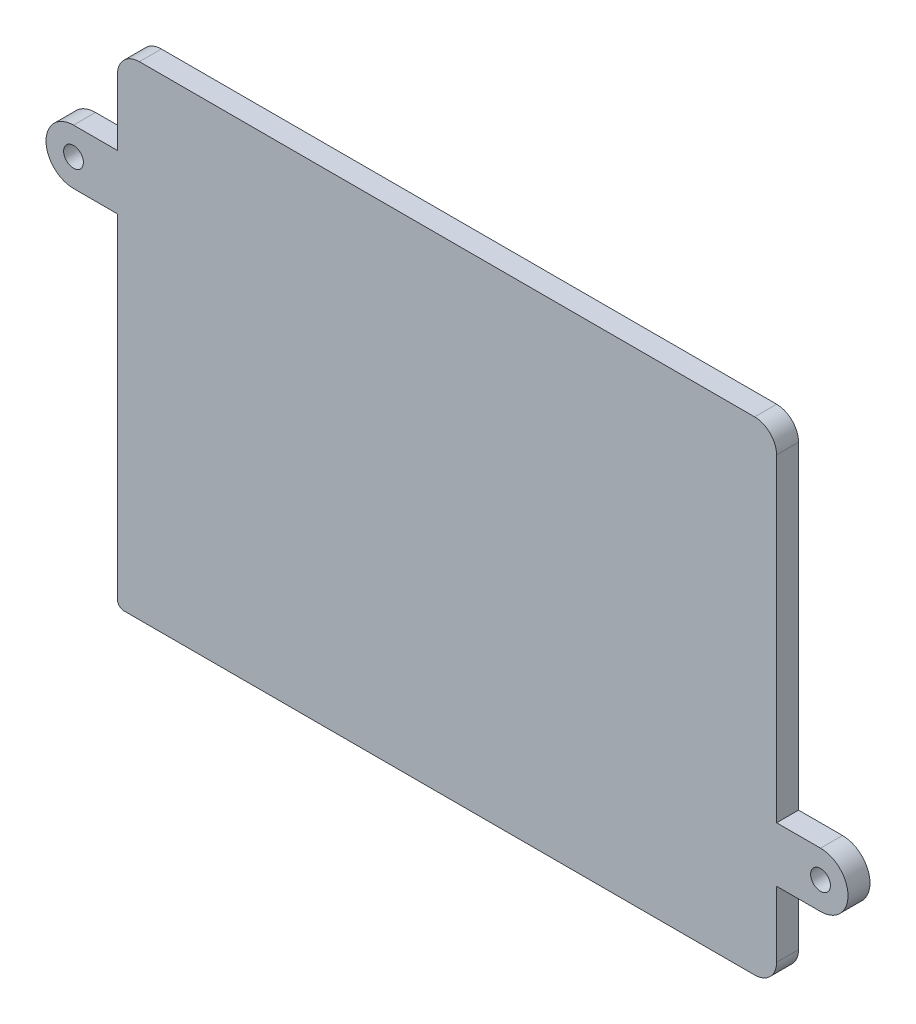
ISO-10303-21;
HEADER;
FILE_DESCRIPTION(('STEP AP214'),'2;1');
FILE_NAME('part.step','',(''),(''),'','','');
FILE_SCHEMA(('AUTOMOTIVE_DESIGN { 1 0 10303 214 1 1 1 1 }'));
ENDSEC;
DATA;
#1=APPLICATION_CONTEXT('core data for automotive mechanical design processes');
#2=APPLICATION_PROTOCOL_DEFINITION('international standard','automotive_design',2000,#1);
#3=PRODUCT_CONTEXT('',#1,'mechanical');
#4=PRODUCT('Part','Part','',(#3));
#5=PRODUCT_RELATED_PRODUCT_CATEGORY('part','',(#4));
#6=PRODUCT_DEFINITION_FORMATION('','',#4);
#7=PRODUCT_DEFINITION_CONTEXT('part definition',#1,'design');
#8=PRODUCT_DEFINITION('design','',#6,#7);
#9=PRODUCT_DEFINITION_SHAPE('','',#8);
#10=(LENGTH_UNIT() NAMED_UNIT(*) SI_UNIT(.MILLI.,.METRE.));
#11=(NAMED_UNIT(*) PLANE_ANGLE_UNIT() SI_UNIT($,.RADIAN.));
#12=(NAMED_UNIT(*) SI_UNIT($,.STERADIAN.) SOLID_ANGLE_UNIT());
#13=UNCERTAINTY_MEASURE_WITH_UNIT(LENGTH_MEASURE(1.E-05),#10,'distance_accuracy_value','');
#14=(GEOMETRIC_REPRESENTATION_CONTEXT(3) GLOBAL_UNCERTAINTY_ASSIGNED_CONTEXT((#13)) GLOBAL_UNIT_ASSIGNED_CONTEXT((#10,
#11,#12)) REPRESENTATION_CONTEXT('',''));
#15=CARTESIAN_POINT('',(0.,0.,0.));
#16=DIRECTION('',(0.,0.,1.));
#17=DIRECTION('',(1.,0.,0.));
#18=AXIS2_PLACEMENT_3D('',#15,#16,#17);
#19=CARTESIAN_POINT('',(0.,0.,0.));
#20=DIRECTION('',(0.,0.,1.));
#21=DIRECTION('',(1.,0.,0.));
#22=AXIS2_PLACEMENT_3D('',#19,#20,#21);
#23=PLANE('',#22);
#24=DIRECTION('',(-1.,0.,0.));
#25=VECTOR('',#24,1.);
#26=CARTESIAN_POINT('',(0.,55.,0.));
#27=LINE('',#26,#25);
#28=CARTESIAN_POINT('',(70.0000000000001,55.,0.));
#29=VERTEX_POINT('',#28);
#30=CARTESIAN_POINT('',(-69.9999999999999,55.,0.));
#31=VERTEX_POINT('',#30);
#32=EDGE_CURVE('E208',#29,#31,#27,.T.);
#33=ORIENTED_EDGE('',*,*,#32,.F.);
#34=CARTESIAN_POINT('',(70.0000000000001,50.,0.));
#35=DIRECTION('',(0.,0.,1.));
#36=DIRECTION('',(1.,0.,0.));
#37=AXIS2_PLACEMENT_3D('',#34,#35,#36);
#38=CIRCLE('',#37,5.);
#39=CARTESIAN_POINT('',(75.0000000000001,50.,0.));
#40=VERTEX_POINT('',#39);
#41=EDGE_CURVE('E349',#40,#29,#38,.T.);
#42=ORIENTED_EDGE('',*,*,#41,.F.);
#43=DIRECTION('',(0.,1.,0.));
#44=VECTOR('',#43,1.);
#45=CARTESIAN_POINT('',(75.0000000000001,0.,0.));
#46=LINE('',#45,#44);
#47=CARTESIAN_POINT('',(75.0000000000001,-22.5000000000001,0.));
#48=VERTEX_POINT('',#47);
#49=EDGE_CURVE('E347',#48,#40,#46,.T.);
#50=ORIENTED_EDGE('',*,*,#49,.F.);
#51=DIRECTION('',(-1.,0.,0.));
#52=VECTOR('',#51,1.);
#53=CARTESIAN_POINT('',(0.,-22.5000000000002,0.));
#54=LINE('',#53,#52);
#55=CARTESIAN_POINT('',(85.0000000000002,-22.5,0.));
#56=VERTEX_POINT('',#55);
#57=EDGE_CURVE('E345',#56,#48,#54,.T.);
#58=ORIENTED_EDGE('',*,*,#57,.F.);
#59=CARTESIAN_POINT('',(85.0000000000001,-28.75,0.));
#60=DIRECTION('',(0.,0.,1.));
#61=DIRECTION('',(1.,0.,0.));
#62=AXIS2_PLACEMENT_3D('',#59,#60,#61);
#63=CIRCLE('',#62,6.25);
#64=CARTESIAN_POINT('',(85.0000000000002,-35.,0.));
#65=VERTEX_POINT('',#64);
#66=EDGE_CURVE('E343',#65,#56,#63,.T.);
#67=ORIENTED_EDGE('',*,*,#66,.F.);
#68=DIRECTION('',(-1.,0.,0.));
#69=VECTOR('',#68,1.);
#70=CARTESIAN_POINT('',(0.,-34.9999999999998,0.));
#71=LINE('',#70,#69);
#72=CARTESIAN_POINT('',(75.0000000000001,-35.,0.));
#73=VERTEX_POINT('',#72);
#74=EDGE_CURVE('E340',#65,#73,#71,.T.);
#75=ORIENTED_EDGE('',*,*,#74,.T.);
#76=DIRECTION('',(0.,1.,0.));
#77=VECTOR('',#76,1.);
#78=CARTESIAN_POINT('',(75.0000000000001,0.,0.));
#79=LINE('',#78,#77);
#80=CARTESIAN_POINT('',(75.0000000000001,-50.,0.));
#81=VERTEX_POINT('',#80);
#82=EDGE_CURVE('E337',#81,#73,#79,.T.);
#83=ORIENTED_EDGE('',*,*,#82,.F.);
#84=CARTESIAN_POINT('',(70.0000000000001,-50.,0.));
#85=DIRECTION('',(0.,0.,1.));
#86=DIRECTION('',(1.,0.,0.));
#87=AXIS2_PLACEMENT_3D('',#84,#85,#86);
#88=CIRCLE('',#87,5.);
#89=CARTESIAN_POINT('',(70.0000000000001,-55.,0.));
#90=VERTEX_POINT('',#89);
#91=EDGE_CURVE('E335',#90,#81,#88,.T.);
#92=ORIENTED_EDGE('',*,*,#91,.F.);
#93=DIRECTION('',(1.,0.,0.));
#94=VECTOR('',#93,1.);
#95=CARTESIAN_POINT('',(0.,-55.,0.));
#96=LINE('',#95,#94);
#97=CARTESIAN_POINT('',(-73.4999999999999,-55.,0.));
#98=VERTEX_POINT('',#97);
#99=EDGE_CURVE('E333',#98,#90,#96,.T.);
#100=ORIENTED_EDGE('',*,*,#99,.F.);
#101=CARTESIAN_POINT('',(-73.4999999999999,-53.5,0.));
#102=DIRECTION('',(0.,0.,1.));
#103=DIRECTION('',(1.,0.,0.));
#104=AXIS2_PLACEMENT_3D('',#101,#102,#103);
#105=CIRCLE('',#104,1.5);
#106=CARTESIAN_POINT('',(-74.9999999999999,-53.5,0.));
#107=VERTEX_POINT('',#106);
#108=EDGE_CURVE('E331',#107,#98,#105,.T.);
#109=ORIENTED_EDGE('',*,*,#108,.F.);
#110=DIRECTION('',(0.,-1.,0.));
#111=VECTOR('',#110,1.);
#112=CARTESIAN_POINT('',(-74.9999999999999,0.,0.));
#113=LINE('',#112,#111);
#114=CARTESIAN_POINT('',(-74.9999999999999,22.5,0.));
#115=VERTEX_POINT('',#114);
#116=EDGE_CURVE('E329',#115,#107,#113,.T.);
#117=ORIENTED_EDGE('',*,*,#116,.F.);
#118=DIRECTION('',(1.,0.,0.));
#119=VECTOR('',#118,1.);
#120=CARTESIAN_POINT('',(0.,22.5,0.));
#121=LINE('',#120,#119);
#122=CARTESIAN_POINT('',(-84.9999999999998,22.5,0.));
#123=VERTEX_POINT('',#122);
#124=EDGE_CURVE('E327',#123,#115,#121,.T.);
#125=ORIENTED_EDGE('',*,*,#124,.F.);
#126=CARTESIAN_POINT('',(-84.9999999999998,28.75,0.));
#127=DIRECTION('',(0.,0.,1.));
#128=DIRECTION('',(1.,0.,0.));
#129=AXIS2_PLACEMENT_3D('',#126,#127,#128);
#130=CIRCLE('',#129,6.2499999999999);
#131=CARTESIAN_POINT('',(-84.9999999999997,34.9999999999999,0.));
#132=VERTEX_POINT('',#131);
#133=EDGE_CURVE('E325',#132,#123,#130,.T.);
#134=ORIENTED_EDGE('',*,*,#133,.F.);
#135=DIRECTION('',(1.,0.,0.));
#136=VECTOR('',#135,1.);
#137=CARTESIAN_POINT('',(0.,35.0000000000002,0.));
#138=LINE('',#137,#136);
#139=CARTESIAN_POINT('',(-74.9999999999999,35.,0.));
#140=VERTEX_POINT('',#139);
#141=EDGE_CURVE('E322',#132,#140,#138,.T.);
#142=ORIENTED_EDGE('',*,*,#141,.T.);
#143=DIRECTION('',(0.,-1.,0.));
#144=VECTOR('',#143,1.);
#145=CARTESIAN_POINT('',(-74.9999999999999,0.,0.));
#146=LINE('',#145,#144);
#147=CARTESIAN_POINT('',(-74.9999999999999,50.,0.));
#148=VERTEX_POINT('',#147);
#149=EDGE_CURVE('E319',#148,#140,#146,.T.);
#150=ORIENTED_EDGE('',*,*,#149,.F.);
#151=CARTESIAN_POINT('',(-69.9999999999999,50.,0.));
#152=DIRECTION('',(0.,0.,1.));
#153=DIRECTION('',(1.,0.,0.));
#154=AXIS2_PLACEMENT_3D('',#151,#152,#153);
#155=CIRCLE('',#154,5.);
#156=EDGE_CURVE('E317',#31,#148,#155,.T.);
#157=ORIENTED_EDGE('',*,*,#156,.F.);
#158=EDGE_LOOP('',(#33,#42,#50,#58,#67,#75,#83,#92,#100,#109,#117,#125,#134,#142,#150,#157));
#159=FACE_BOUND('',#158,.T.);
#160=CARTESIAN_POINT('',(85.0000000000001,-28.75,0.));
#161=DIRECTION('',(0.,0.,1.));
#162=DIRECTION('',(1.,0.,0.));
#163=AXIS2_PLACEMENT_3D('',#160,#161,#162);
#164=CIRCLE('',#163,2.25);
#165=CARTESIAN_POINT('',(87.2500000000001,-28.75,0.));
#166=VERTEX_POINT('',#165);
#167=EDGE_CURVE('E351',#166,#166,#164,.T.);
#168=ORIENTED_EDGE('',*,*,#167,.T.);
#169=EDGE_LOOP('',(#168));
#170=FACE_BOUND('',#169,.T.);
#171=CARTESIAN_POINT('',(-84.9999999999998,28.75,0.));
#172=DIRECTION('',(0.,0.,1.));
#173=DIRECTION('',(1.,0.,0.));
#174=AXIS2_PLACEMENT_3D('',#171,#172,#173);
#175=CIRCLE('',#174,2.24999999999989);
#176=CARTESIAN_POINT('',(-82.7499999999999,28.75,0.));
#177=VERTEX_POINT('',#176);
#178=EDGE_CURVE('E276',#177,#177,#175,.T.);
#179=ORIENTED_EDGE('',*,*,#178,.T.);
#180=EDGE_LOOP('',(#179));
#181=FACE_BOUND('',#180,.T.);
#182=CARTESIAN_POINT('',(65.0000000000001,-45.,0.));
#183=DIRECTION('',(0.,0.,-1.));
#184=DIRECTION('',(-1.,0.,0.));
#185=AXIS2_PLACEMENT_3D('',#182,#183,#184);
#186=CIRCLE('',#185,3.5);
#187=CARTESIAN_POINT('',(68.5000000000001,-45.,0.));
#188=VERTEX_POINT('',#187);
#189=CARTESIAN_POINT('',(65.0000000000001,-48.5,0.));
#190=VERTEX_POINT('',#189);
#191=EDGE_CURVE('E243',#188,#190,#186,.T.);
#192=ORIENTED_EDGE('',*,*,#191,.F.);
#193=DIRECTION('',(0.,1.,0.));
#194=VECTOR('',#193,1.);
#195=CARTESIAN_POINT('',(68.5000000000001,0.,0.));
#196=LINE('',#195,#194);
#197=CARTESIAN_POINT('',(68.5000000000001,45.,0.));
#198=VERTEX_POINT('',#197);
#199=EDGE_CURVE('E56',#188,#198,#196,.T.);
#200=ORIENTED_EDGE('',*,*,#199,.T.);
#201=CARTESIAN_POINT('',(65.0000000000001,45.,0.));
#202=DIRECTION('',(0.,0.,-1.));
#203=DIRECTION('',(-1.,0.,0.));
#204=AXIS2_PLACEMENT_3D('',#201,#202,#203);
#205=CIRCLE('',#204,3.5);
#206=CARTESIAN_POINT('',(65.0000000000001,48.5,0.));
#207=VERTEX_POINT('',#206);
#208=EDGE_CURVE('E61',#207,#198,#205,.T.);
#209=ORIENTED_EDGE('',*,*,#208,.F.);
#210=DIRECTION('',(-1.,0.,0.));
#211=VECTOR('',#210,1.);
#212=CARTESIAN_POINT('',(0.,48.5,0.));
#213=LINE('',#212,#211);
#214=CARTESIAN_POINT('',(-64.9999999999999,48.5,0.));
#215=VERTEX_POINT('',#214);
#216=EDGE_CURVE('E226',#207,#215,#213,.T.);
#217=ORIENTED_EDGE('',*,*,#216,.T.);
#218=CARTESIAN_POINT('',(-64.9999999999999,45.,0.));
#219=DIRECTION('',(0.,0.,-1.));
#220=DIRECTION('',(-1.,0.,0.));
#221=AXIS2_PLACEMENT_3D('',#218,#219,#220);
#222=CIRCLE('',#221,3.5);
#223=CARTESIAN_POINT('',(-68.4999999999999,45.,0.));
#224=VERTEX_POINT('',#223);
#225=EDGE_CURVE('E252',#224,#215,#222,.T.);
#226=ORIENTED_EDGE('',*,*,#225,.F.);
#227=DIRECTION('',(0.,-1.,0.));
#228=VECTOR('',#227,1.);
#229=CARTESIAN_POINT('',(-68.4999999999999,0.,0.));
#230=LINE('',#229,#228);
#231=CARTESIAN_POINT('',(-68.4999999999999,-45.,0.));
#232=VERTEX_POINT('',#231);
#233=EDGE_CURVE('E250',#224,#232,#230,.T.);
#234=ORIENTED_EDGE('',*,*,#233,.T.);
#235=CARTESIAN_POINT('',(-64.9999999999999,-45.,0.));
#236=DIRECTION('',(0.,0.,-1.));
#237=DIRECTION('',(-1.,0.,0.));
#238=AXIS2_PLACEMENT_3D('',#235,#236,#237);
#239=CIRCLE('',#238,3.5);
#240=CARTESIAN_POINT('',(-64.9999999999999,-48.5,0.));
#241=VERTEX_POINT('',#240);
#242=EDGE_CURVE('E247',#241,#232,#239,.T.);
#243=ORIENTED_EDGE('',*,*,#242,.F.);
#244=DIRECTION('',(1.,0.,0.));
#245=VECTOR('',#244,1.);
#246=CARTESIAN_POINT('',(0.,-48.5,0.));
#247=LINE('',#246,#245);
#248=EDGE_CURVE('E245',#241,#190,#247,.T.);
#249=ORIENTED_EDGE('',*,*,#248,.T.);
#250=EDGE_LOOP('',(#192,#200,#209,#217,#226,#234,#243,#249));
#251=FACE_BOUND('',#250,.T.);
#252=ADVANCED_FACE('F41',(#159,#170,#181,#251),#23,.F.);
#253=CARTESIAN_POINT('',(0.,55.,5.));
#254=DIRECTION('',(0.,-1.,0.));
#255=DIRECTION('',(0.,0.,-1.));
#256=AXIS2_PLACEMENT_3D('',#253,#254,#255);
#257=PLANE('',#256);
#258=ORIENTED_EDGE('',*,*,#32,.T.);
#259=DIRECTION('',(0.,0.,-1.));
#260=VECTOR('',#259,1.);
#261=CARTESIAN_POINT('',(-69.9999999999999,55.,5.));
#262=LINE('',#261,#260);
#263=CARTESIAN_POINT('',(-69.9999999999999,55.,5.));
#264=VERTEX_POINT('',#263);
#265=EDGE_CURVE('E11',#264,#31,#262,.T.);
#266=ORIENTED_EDGE('',*,*,#265,.F.);
#267=DIRECTION('',(-1.,0.,0.));
#268=VECTOR('',#267,1.);
#269=CARTESIAN_POINT('',(0.,55.,5.));
#270=LINE('',#269,#268);
#271=CARTESIAN_POINT('',(70.0000000000001,55.,5.));
#272=VERTEX_POINT('',#271);
#273=EDGE_CURVE('E272',#272,#264,#270,.T.);
#274=ORIENTED_EDGE('',*,*,#273,.F.);
#275=DIRECTION('',(0.,0.,-1.));
#276=VECTOR('',#275,1.);
#277=CARTESIAN_POINT('',(70.0000000000001,55.,5.));
#278=LINE('',#277,#276);
#279=EDGE_CURVE('E314',#272,#29,#278,.T.);
#280=ORIENTED_EDGE('',*,*,#279,.T.);
#281=EDGE_LOOP('',(#258,#266,#274,#280));
#282=FACE_BOUND('',#281,.T.);
#283=ADVANCED_FACE('F43',(#282),#257,.F.);
#284=CARTESIAN_POINT('',(-69.9999999999999,50.,5.));
#285=DIRECTION('',(0.,0.,-1.));
#286=DIRECTION('',(-1.,0.,0.));
#287=AXIS2_PLACEMENT_3D('',#284,#285,#286);
#288=CYLINDRICAL_SURFACE('',#287,5.);
#289=ORIENTED_EDGE('',*,*,#156,.T.);
#290=DIRECTION('',(0.,0.,-1.));
#291=VECTOR('',#290,1.);
#292=CARTESIAN_POINT('',(-74.9999999999999,50.,5.));
#293=LINE('',#292,#291);
#294=CARTESIAN_POINT('',(-74.9999999999999,50.,5.));
#295=VERTEX_POINT('',#294);
#296=EDGE_CURVE('E49',#295,#148,#293,.T.);
#297=ORIENTED_EDGE('',*,*,#296,.F.);
#298=CARTESIAN_POINT('',(-69.9999999999999,50.,5.));
#299=DIRECTION('',(0.,0.,1.));
#300=DIRECTION('',(1.,0.,0.));
#301=AXIS2_PLACEMENT_3D('',#298,#299,#300);
#302=CIRCLE('',#301,5.);
#303=EDGE_CURVE('E275',#264,#295,#302,.T.);
#304=ORIENTED_EDGE('',*,*,#303,.F.);
#305=ORIENTED_EDGE('',*,*,#265,.T.);
#306=EDGE_LOOP('',(#289,#297,#304,#305));
#307=FACE_BOUND('',#306,.T.);
#308=ADVANCED_FACE('F416',(#307),#288,.T.);
#309=CARTESIAN_POINT('',(-74.9999999999999,0.,5.));
#310=DIRECTION('',(1.,0.,0.));
#311=DIRECTION('',(0.,0.,-1.));
#312=AXIS2_PLACEMENT_3D('',#309,#310,#311);
#313=PLANE('',#312);
#314=ORIENTED_EDGE('',*,*,#149,.T.);
#315=DIRECTION('',(0.,0.,-1.));
#316=VECTOR('',#315,1.);
#317=CARTESIAN_POINT('',(-74.9999999999999,35.,5.));
#318=LINE('',#317,#316);
#319=CARTESIAN_POINT('',(-74.9999999999999,35.,5.));
#320=VERTEX_POINT('',#319);
#321=EDGE_CURVE('E391',#320,#140,#318,.T.);
#322=ORIENTED_EDGE('',*,*,#321,.F.);
#323=DIRECTION('',(0.,-1.,0.));
#324=VECTOR('',#323,1.);
#325=CARTESIAN_POINT('',(-74.9999999999999,0.,5.));
#326=LINE('',#325,#324);
#327=EDGE_CURVE('E278',#295,#320,#326,.T.);
#328=ORIENTED_EDGE('',*,*,#327,.F.);
#329=ORIENTED_EDGE('',*,*,#296,.T.);
#330=EDGE_LOOP('',(#314,#322,#328,#329));
#331=FACE_BOUND('',#330,.T.);
#332=ADVANCED_FACE('F397',(#331),#313,.F.);
#333=CARTESIAN_POINT('',(0.,35.0000000000002,5.));
#334=DIRECTION('',(0.,1.,0.));
#335=DIRECTION('',(-1.,0.,0.));
#336=AXIS2_PLACEMENT_3D('',#333,#334,#335);
#337=PLANE('',#336);
#338=ORIENTED_EDGE('',*,*,#141,.F.);
#339=DIRECTION('',(0.,0.,-1.));
#340=VECTOR('',#339,1.);
#341=CARTESIAN_POINT('',(-84.9999999999997,34.9999999999999,5.));
#342=LINE('',#341,#340);
#343=CARTESIAN_POINT('',(-84.9999999999997,34.9999999999999,5.));
#344=VERTEX_POINT('',#343);
#345=EDGE_CURVE('E389',#344,#132,#342,.T.);
#346=ORIENTED_EDGE('',*,*,#345,.F.);
#347=DIRECTION('',(1.,0.,0.));
#348=VECTOR('',#347,1.);
#349=CARTESIAN_POINT('',(0.,35.0000000000002,5.));
#350=LINE('',#349,#348);
#351=EDGE_CURVE('E280',#344,#320,#350,.T.);
#352=ORIENTED_EDGE('',*,*,#351,.T.);
#353=ORIENTED_EDGE('',*,*,#321,.T.);
#354=EDGE_LOOP('',(#338,#346,#352,#353));
#355=FACE_BOUND('',#354,.T.);
#356=ADVANCED_FACE('F407',(#355),#337,.T.);
#357=CARTESIAN_POINT('',(-84.9999999999998,28.75,5.));
#358=DIRECTION('',(0.,0.,-1.));
#359=DIRECTION('',(-1.,0.,0.));
#360=AXIS2_PLACEMENT_3D('',#357,#358,#359);
#361=CYLINDRICAL_SURFACE('',#360,6.2499999999999);
#362=ORIENTED_EDGE('',*,*,#133,.T.);
#363=DIRECTION('',(0.,0.,-1.));
#364=VECTOR('',#363,1.);
#365=CARTESIAN_POINT('',(-84.9999999999998,22.5,5.));
#366=LINE('',#365,#364);
#367=CARTESIAN_POINT('',(-84.9999999999998,22.5,5.));
#368=VERTEX_POINT('',#367);
#369=EDGE_CURVE('E386',#368,#123,#366,.T.);
#370=ORIENTED_EDGE('',*,*,#369,.F.);
#371=CARTESIAN_POINT('',(-84.9999999999998,28.75,5.));
#372=DIRECTION('',(0.,0.,1.));
#373=DIRECTION('',(1.,0.,0.));
#374=AXIS2_PLACEMENT_3D('',#371,#372,#373);
#375=CIRCLE('',#374,6.2499999999999);
#376=EDGE_CURVE('E283',#344,#368,#375,.T.);
#377=ORIENTED_EDGE('',*,*,#376,.F.);
#378=ORIENTED_EDGE('',*,*,#345,.T.);
#379=EDGE_LOOP('',(#362,#370,#377,#378));
#380=FACE_BOUND('',#379,.T.);
#381=ADVANCED_FACE('F471',(#380),#361,.T.);
#382=CARTESIAN_POINT('',(0.,22.5,5.));
#383=DIRECTION('',(0.,1.,0.));
#384=DIRECTION('',(0.,0.,1.));
#385=AXIS2_PLACEMENT_3D('',#382,#383,#384);
#386=PLANE('',#385);
#387=ORIENTED_EDGE('',*,*,#124,.T.);
#388=DIRECTION('',(0.,0.,-1.));
#389=VECTOR('',#388,1.);
#390=CARTESIAN_POINT('',(-74.9999999999999,22.5,5.));
#391=LINE('',#390,#389);
#392=CARTESIAN_POINT('',(-74.9999999999999,22.5,5.));
#393=VERTEX_POINT('',#392);
#394=EDGE_CURVE('E383',#393,#115,#391,.T.);
#395=ORIENTED_EDGE('',*,*,#394,.F.);
#396=DIRECTION('',(1.,0.,0.));
#397=VECTOR('',#396,1.);
#398=CARTESIAN_POINT('',(0.,22.5,5.));
#399=LINE('',#398,#397);
#400=EDGE_CURVE('E285',#368,#393,#399,.T.);
#401=ORIENTED_EDGE('',*,*,#400,.F.);
#402=ORIENTED_EDGE('',*,*,#369,.T.);
#403=EDGE_LOOP('',(#387,#395,#401,#402));
#404=FACE_BOUND('',#403,.T.);
#405=ADVANCED_FACE('F469',(#404),#386,.F.);
#406=CARTESIAN_POINT('',(-74.9999999999999,0.,5.));
#407=DIRECTION('',(1.,0.,0.));
#408=DIRECTION('',(0.,0.,-1.));
#409=AXIS2_PLACEMENT_3D('',#406,#407,#408);
#410=PLANE('',#409);
#411=ORIENTED_EDGE('',*,*,#116,.T.);
#412=DIRECTION('',(0.,0.,-1.));
#413=VECTOR('',#412,1.);
#414=CARTESIAN_POINT('',(-74.9999999999999,-53.5,5.));
#415=LINE('',#414,#413);
#416=CARTESIAN_POINT('',(-74.9999999999999,-53.5,5.));
#417=VERTEX_POINT('',#416);
#418=EDGE_CURVE('E380',#417,#107,#415,.T.);
#419=ORIENTED_EDGE('',*,*,#418,.F.);
#420=DIRECTION('',(0.,-1.,0.));
#421=VECTOR('',#420,1.);
#422=CARTESIAN_POINT('',(-74.9999999999999,0.,5.));
#423=LINE('',#422,#421);
#424=EDGE_CURVE('E287',#393,#417,#423,.T.);
#425=ORIENTED_EDGE('',*,*,#424,.F.);
#426=ORIENTED_EDGE('',*,*,#394,.T.);
#427=EDGE_LOOP('',(#411,#419,#425,#426));
#428=FACE_BOUND('',#427,.T.);
#429=ADVANCED_FACE('F464',(#428),#410,.F.);
#430=CARTESIAN_POINT('',(-73.4999999999999,-53.5,5.));
#431=DIRECTION('',(0.,0.,-1.));
#432=DIRECTION('',(-1.,0.,0.));
#433=AXIS2_PLACEMENT_3D('',#430,#431,#432);
#434=CYLINDRICAL_SURFACE('',#433,1.5);
#435=ORIENTED_EDGE('',*,*,#108,.T.);
#436=DIRECTION('',(0.,0.,-1.));
#437=VECTOR('',#436,1.);
#438=CARTESIAN_POINT('',(-73.4999999999999,-55.,5.));
#439=LINE('',#438,#437);
#440=CARTESIAN_POINT('',(-73.4999999999999,-55.,5.));
#441=VERTEX_POINT('',#440);
#442=EDGE_CURVE('E377',#441,#98,#439,.T.);
#443=ORIENTED_EDGE('',*,*,#442,.F.);
#444=CARTESIAN_POINT('',(-73.4999999999999,-53.5,5.));
#445=DIRECTION('',(0.,0.,1.));
#446=DIRECTION('',(1.,0.,0.));
#447=AXIS2_PLACEMENT_3D('',#444,#445,#446);
#448=CIRCLE('',#447,1.5);
#449=EDGE_CURVE('E289',#417,#441,#448,.T.);
#450=ORIENTED_EDGE('',*,*,#449,.F.);
#451=ORIENTED_EDGE('',*,*,#418,.T.);
#452=EDGE_LOOP('',(#435,#443,#450,#451));
#453=FACE_BOUND('',#452,.T.);
#454=ADVANCED_FACE('F460',(#453),#434,.T.);
#455=CARTESIAN_POINT('',(0.,-55.,5.));
#456=DIRECTION('',(0.,1.,0.));
#457=DIRECTION('',(0.,0.,1.));
#458=AXIS2_PLACEMENT_3D('',#455,#456,#457);
#459=PLANE('',#458);
#460=ORIENTED_EDGE('',*,*,#99,.T.);
#461=DIRECTION('',(0.,0.,-1.));
#462=VECTOR('',#461,1.);
#463=CARTESIAN_POINT('',(70.0000000000001,-55.,5.));
#464=LINE('',#463,#462);
#465=CARTESIAN_POINT('',(70.0000000000001,-55.,5.));
#466=VERTEX_POINT('',#465);
#467=EDGE_CURVE('E374',#466,#90,#464,.T.);
#468=ORIENTED_EDGE('',*,*,#467,.F.);
#469=DIRECTION('',(1.,0.,0.));
#470=VECTOR('',#469,1.);
#471=CARTESIAN_POINT('',(0.,-55.,5.));
#472=LINE('',#471,#470);
#473=EDGE_CURVE('E291',#441,#466,#472,.T.);
#474=ORIENTED_EDGE('',*,*,#473,.F.);
#475=ORIENTED_EDGE('',*,*,#442,.T.);
#476=EDGE_LOOP('',(#460,#468,#474,#475));
#477=FACE_BOUND('',#476,.T.);
#478=ADVANCED_FACE('F456',(#477),#459,.F.);
#479=CARTESIAN_POINT('',(70.0000000000001,-50.,5.));
#480=DIRECTION('',(0.,0.,-1.));
#481=DIRECTION('',(-1.,0.,0.));
#482=AXIS2_PLACEMENT_3D('',#479,#480,#481);
#483=CYLINDRICAL_SURFACE('',#482,5.);
#484=ORIENTED_EDGE('',*,*,#91,.T.);
#485=DIRECTION('',(0.,0.,-1.));
#486=VECTOR('',#485,1.);
#487=CARTESIAN_POINT('',(75.0000000000001,-50.,5.));
#488=LINE('',#487,#486);
#489=CARTESIAN_POINT('',(75.0000000000001,-50.,5.));
#490=VERTEX_POINT('',#489);
#491=EDGE_CURVE('E371',#490,#81,#488,.T.);
#492=ORIENTED_EDGE('',*,*,#491,.F.);
#493=CARTESIAN_POINT('',(70.0000000000001,-50.,5.));
#494=DIRECTION('',(0.,0.,1.));
#495=DIRECTION('',(1.,0.,0.));
#496=AXIS2_PLACEMENT_3D('',#493,#494,#495);
#497=CIRCLE('',#496,5.);
#498=EDGE_CURVE('E293',#466,#490,#497,.T.);
#499=ORIENTED_EDGE('',*,*,#498,.F.);
#500=ORIENTED_EDGE('',*,*,#467,.T.);
#501=EDGE_LOOP('',(#484,#492,#499,#500));
#502=FACE_BOUND('',#501,.T.);
#503=ADVANCED_FACE('F451',(#502),#483,.T.);
#504=CARTESIAN_POINT('',(75.0000000000001,0.,5.));
#505=DIRECTION('',(-1.,0.,0.));
#506=DIRECTION('',(0.,0.,1.));
#507=AXIS2_PLACEMENT_3D('',#504,#505,#506);
#508=PLANE('',#507);
#509=ORIENTED_EDGE('',*,*,#82,.T.);
#510=DIRECTION('',(0.,0.,-1.));
#511=VECTOR('',#510,1.);
#512=CARTESIAN_POINT('',(75.0000000000001,-35.,5.));
#513=LINE('',#512,#511);
#514=CARTESIAN_POINT('',(75.0000000000001,-35.,5.));
#515=VERTEX_POINT('',#514);
#516=EDGE_CURVE('E369',#515,#73,#513,.T.);
#517=ORIENTED_EDGE('',*,*,#516,.F.);
#518=DIRECTION('',(0.,1.,0.));
#519=VECTOR('',#518,1.);
#520=CARTESIAN_POINT('',(75.0000000000001,0.,5.));
#521=LINE('',#520,#519);
#522=EDGE_CURVE('E295',#490,#515,#521,.T.);
#523=ORIENTED_EDGE('',*,*,#522,.F.);
#524=ORIENTED_EDGE('',*,*,#491,.T.);
#525=EDGE_LOOP('',(#509,#517,#523,#524));
#526=FACE_BOUND('',#525,.T.);
#527=ADVANCED_FACE('F445',(#526),#508,.F.);
#528=CARTESIAN_POINT('',(0.,-34.9999999999998,5.));
#529=DIRECTION('',(0.,-1.,0.));
#530=DIRECTION('',(1.,0.,0.));
#531=AXIS2_PLACEMENT_3D('',#528,#529,#530);
#532=PLANE('',#531);
#533=ORIENTED_EDGE('',*,*,#74,.F.);
#534=DIRECTION('',(0.,0.,-1.));
#535=VECTOR('',#534,1.);
#536=CARTESIAN_POINT('',(85.0000000000002,-35.,5.));
#537=LINE('',#536,#535);
#538=CARTESIAN_POINT('',(85.0000000000002,-35.,5.));
#539=VERTEX_POINT('',#538);
#540=EDGE_CURVE('E367',#539,#65,#537,.T.);
#541=ORIENTED_EDGE('',*,*,#540,.F.);
#542=DIRECTION('',(-1.,0.,0.));
#543=VECTOR('',#542,1.);
#544=CARTESIAN_POINT('',(0.,-34.9999999999998,5.));
#545=LINE('',#544,#543);
#546=EDGE_CURVE('E297',#539,#515,#545,.T.);
#547=ORIENTED_EDGE('',*,*,#546,.T.);
#548=ORIENTED_EDGE('',*,*,#516,.T.);
#549=EDGE_LOOP('',(#533,#541,#547,#548));
#550=FACE_BOUND('',#549,.T.);
#551=ADVANCED_FACE('F439',(#550),#532,.T.);
#552=CARTESIAN_POINT('',(85.0000000000001,-28.75,5.));
#553=DIRECTION('',(0.,0.,-1.));
#554=DIRECTION('',(-1.,0.,0.));
#555=AXIS2_PLACEMENT_3D('',#552,#553,#554);
#556=CYLINDRICAL_SURFACE('',#555,6.25);
#557=ORIENTED_EDGE('',*,*,#66,.T.);
#558=DIRECTION('',(0.,0.,-1.));
#559=VECTOR('',#558,1.);
#560=CARTESIAN_POINT('',(85.0000000000002,-22.5,5.));
#561=LINE('',#560,#559);
#562=CARTESIAN_POINT('',(85.0000000000002,-22.5,5.));
#563=VERTEX_POINT('',#562);
#564=EDGE_CURVE('E364',#563,#56,#561,.T.);
#565=ORIENTED_EDGE('',*,*,#564,.F.);
#566=CARTESIAN_POINT('',(85.0000000000001,-28.75,5.));
#567=DIRECTION('',(0.,0.,1.));
#568=DIRECTION('',(1.,0.,0.));
#569=AXIS2_PLACEMENT_3D('',#566,#567,#568);
#570=CIRCLE('',#569,6.25);
#571=EDGE_CURVE('E300',#539,#563,#570,.T.);
#572=ORIENTED_EDGE('',*,*,#571,.F.);
#573=ORIENTED_EDGE('',*,*,#540,.T.);
#574=EDGE_LOOP('',(#557,#565,#572,#573));
#575=FACE_BOUND('',#574,.T.);
#576=ADVANCED_FACE('F504',(#575),#556,.T.);
#577=CARTESIAN_POINT('',(0.,-22.5000000000002,5.));
#578=DIRECTION('',(0.,-1.,0.));
#579=DIRECTION('',(1.,0.,0.));
#580=AXIS2_PLACEMENT_3D('',#577,#578,#579);
#581=PLANE('',#580);
#582=ORIENTED_EDGE('',*,*,#57,.T.);
#583=DIRECTION('',(0.,0.,-1.));
#584=VECTOR('',#583,1.);
#585=CARTESIAN_POINT('',(75.0000000000001,-22.5000000000001,5.));
#586=LINE('',#585,#584);
#587=CARTESIAN_POINT('',(75.0000000000001,-22.5000000000001,5.));
#588=VERTEX_POINT('',#587);
#589=EDGE_CURVE('E361',#588,#48,#586,.T.);
#590=ORIENTED_EDGE('',*,*,#589,.F.);
#591=DIRECTION('',(-1.,0.,0.));
#592=VECTOR('',#591,1.);
#593=CARTESIAN_POINT('',(0.,-22.5000000000002,5.));
#594=LINE('',#593,#592);
#595=EDGE_CURVE('E302',#563,#588,#594,.T.);
#596=ORIENTED_EDGE('',*,*,#595,.F.);
#597=ORIENTED_EDGE('',*,*,#564,.T.);
#598=EDGE_LOOP('',(#582,#590,#596,#597));
#599=FACE_BOUND('',#598,.T.);
#600=ADVANCED_FACE('F432',(#599),#581,.F.);
#601=CARTESIAN_POINT('',(75.0000000000001,0.,5.));
#602=DIRECTION('',(-1.,0.,0.));
#603=DIRECTION('',(0.,0.,1.));
#604=AXIS2_PLACEMENT_3D('',#601,#602,#603);
#605=PLANE('',#604);
#606=ORIENTED_EDGE('',*,*,#49,.T.);
#607=DIRECTION('',(0.,0.,-1.));
#608=VECTOR('',#607,1.);
#609=CARTESIAN_POINT('',(75.0000000000001,50.,5.));
#610=LINE('',#609,#608);
#611=CARTESIAN_POINT('',(75.0000000000001,50.,5.));
#612=VERTEX_POINT('',#611);
#613=EDGE_CURVE('E358',#612,#40,#610,.T.);
#614=ORIENTED_EDGE('',*,*,#613,.F.);
#615=DIRECTION('',(0.,1.,0.));
#616=VECTOR('',#615,1.);
#617=CARTESIAN_POINT('',(75.0000000000001,0.,5.));
#618=LINE('',#617,#616);
#619=EDGE_CURVE('E304',#588,#612,#618,.T.);
#620=ORIENTED_EDGE('',*,*,#619,.F.);
#621=ORIENTED_EDGE('',*,*,#589,.T.);
#622=EDGE_LOOP('',(#606,#614,#620,#621));
#623=FACE_BOUND('',#622,.T.);
#624=ADVANCED_FACE('F428',(#623),#605,.F.);
#625=CARTESIAN_POINT('',(85.0000000000001,-28.75,5.));
#626=DIRECTION('',(0.,0.,-1.));
#627=DIRECTION('',(-1.,0.,0.));
#628=AXIS2_PLACEMENT_3D('',#625,#626,#627);
#629=CYLINDRICAL_SURFACE('',#628,2.25);
#630=CARTESIAN_POINT('',(85.0000000000001,-28.75,5.));
#631=DIRECTION('',(0.,0.,1.));
#632=DIRECTION('',(1.,0.,0.));
#633=AXIS2_PLACEMENT_3D('',#630,#631,#632);
#634=CIRCLE('',#633,2.25);
#635=CARTESIAN_POINT('',(87.2500000000001,-28.75,5.));
#636=VERTEX_POINT('',#635);
#637=EDGE_CURVE('E308',#636,#636,#634,.T.);
#638=ORIENTED_EDGE('',*,*,#637,.T.);
#639=EDGE_LOOP('',(#638));
#640=FACE_BOUND('',#639,.T.);
#641=ORIENTED_EDGE('',*,*,#167,.F.);
#642=EDGE_LOOP('',(#641));
#643=FACE_BOUND('',#642,.T.);
#644=ADVANCED_FACE('F494',(#640,#643),#629,.F.);
#645=CARTESIAN_POINT('',(70.0000000000001,50.,5.));
#646=DIRECTION('',(0.,0.,-1.));
#647=DIRECTION('',(-1.,0.,0.));
#648=AXIS2_PLACEMENT_3D('',#645,#646,#647);
#649=CYLINDRICAL_SURFACE('',#648,5.);
#650=ORIENTED_EDGE('',*,*,#41,.T.);
#651=ORIENTED_EDGE('',*,*,#279,.F.);
#652=CARTESIAN_POINT('',(70.0000000000001,50.,5.));
#653=DIRECTION('',(0.,0.,1.));
#654=DIRECTION('',(1.,0.,0.));
#655=AXIS2_PLACEMENT_3D('',#652,#653,#654);
#656=CIRCLE('',#655,5.);
#657=EDGE_CURVE('E306',#612,#272,#656,.T.);
#658=ORIENTED_EDGE('',*,*,#657,.F.);
#659=ORIENTED_EDGE('',*,*,#613,.T.);
#660=EDGE_LOOP('',(#650,#651,#658,#659));
#661=FACE_BOUND('',#660,.T.);
#662=ADVANCED_FACE('F423',(#661),#649,.T.);
#663=CARTESIAN_POINT('',(-84.9999999999998,28.75,5.));
#664=DIRECTION('',(0.,0.,-1.));
#665=DIRECTION('',(-1.,0.,0.));
#666=AXIS2_PLACEMENT_3D('',#663,#664,#665);
#667=CYLINDRICAL_SURFACE('',#666,2.24999999999989);
#668=CARTESIAN_POINT('',(-84.9999999999998,28.75,5.));
#669=DIRECTION('',(0.,0.,1.));
#670=DIRECTION('',(1.,0.,0.));
#671=AXIS2_PLACEMENT_3D('',#668,#669,#670);
#672=CIRCLE('',#671,2.24999999999989);
#673=CARTESIAN_POINT('',(-82.7499999999999,28.75,5.));
#674=VERTEX_POINT('',#673);
#675=EDGE_CURVE('E311',#674,#674,#672,.T.);
#676=ORIENTED_EDGE('',*,*,#675,.T.);
#677=EDGE_LOOP('',(#676));
#678=FACE_BOUND('',#677,.T.);
#679=ORIENTED_EDGE('',*,*,#178,.F.);
#680=EDGE_LOOP('',(#679));
#681=FACE_BOUND('',#680,.T.);
#682=ADVANCED_FACE('F490',(#678,#681),#667,.F.);
#683=CARTESIAN_POINT('',(0.,0.,5.));
#684=DIRECTION('',(0.,0.,1.));
#685=DIRECTION('',(1.,0.,0.));
#686=AXIS2_PLACEMENT_3D('',#683,#684,#685);
#687=PLANE('',#686);
#688=ORIENTED_EDGE('',*,*,#273,.T.);
#689=ORIENTED_EDGE('',*,*,#303,.T.);
#690=ORIENTED_EDGE('',*,*,#327,.T.);
#691=ORIENTED_EDGE('',*,*,#351,.F.);
#692=ORIENTED_EDGE('',*,*,#376,.T.);
#693=ORIENTED_EDGE('',*,*,#400,.T.);
#694=ORIENTED_EDGE('',*,*,#424,.T.);
#695=ORIENTED_EDGE('',*,*,#449,.T.);
#696=ORIENTED_EDGE('',*,*,#473,.T.);
#697=ORIENTED_EDGE('',*,*,#498,.T.);
#698=ORIENTED_EDGE('',*,*,#522,.T.);
#699=ORIENTED_EDGE('',*,*,#546,.F.);
#700=ORIENTED_EDGE('',*,*,#571,.T.);
#701=ORIENTED_EDGE('',*,*,#595,.T.);
#702=ORIENTED_EDGE('',*,*,#619,.T.);
#703=ORIENTED_EDGE('',*,*,#657,.T.);
#704=EDGE_LOOP('',(#688,#689,#690,#691,#692,#693,#694,#695,#696,#697,#698,#699,#700,#701,#702,#703));
#705=FACE_BOUND('',#704,.T.);
#706=ORIENTED_EDGE('',*,*,#637,.F.);
#707=EDGE_LOOP('',(#706));
#708=FACE_BOUND('',#707,.T.);
#709=ORIENTED_EDGE('',*,*,#675,.F.);
#710=EDGE_LOOP('',(#709));
#711=FACE_BOUND('',#710,.T.);
#712=ADVANCED_FACE('F411',(#705,#708,#711),#687,.T.);
#713=CARTESIAN_POINT('',(68.5000000000001,0.,-2.));
#714=DIRECTION('',(1.,0.,0.));
#715=DIRECTION('',(0.,0.,-1.));
#716=AXIS2_PLACEMENT_3D('',#713,#714,#715);
#717=PLANE('',#716);
#718=ORIENTED_EDGE('',*,*,#199,.F.);
#719=DIRECTION('',(0.,0.,1.));
#720=VECTOR('',#719,1.);
#721=CARTESIAN_POINT('',(68.5000000000001,-45.,-2.));
#722=LINE('',#721,#720);
#723=CARTESIAN_POINT('',(68.5000000000001,-45.,-2.));
#724=VERTEX_POINT('',#723);
#725=EDGE_CURVE('E201',#724,#188,#722,.T.);
#726=ORIENTED_EDGE('',*,*,#725,.F.);
#727=DIRECTION('',(0.,1.,0.));
#728=VECTOR('',#727,1.);
#729=CARTESIAN_POINT('',(68.5000000000001,0.,-2.));
#730=LINE('',#729,#728);
#731=CARTESIAN_POINT('',(68.5000000000001,45.,-2.));
#732=VERTEX_POINT('',#731);
#733=EDGE_CURVE('E205',#724,#732,#730,.T.);
#734=ORIENTED_EDGE('',*,*,#733,.T.);
#735=DIRECTION('',(0.,0.,1.));
#736=VECTOR('',#735,1.);
#737=CARTESIAN_POINT('',(68.5000000000001,45.,-2.));
#738=LINE('',#737,#736);
#739=EDGE_CURVE('E241',#732,#198,#738,.T.);
#740=ORIENTED_EDGE('',*,*,#739,.T.);
#741=EDGE_LOOP('',(#718,#726,#734,#740));
#742=FACE_BOUND('',#741,.T.);
#743=ADVANCED_FACE('F203',(#742),#717,.T.);
#744=CARTESIAN_POINT('',(65.0000000000001,-45.,-2.));
#745=DIRECTION('',(0.,0.,1.));
#746=DIRECTION('',(1.,0.,0.));
#747=AXIS2_PLACEMENT_3D('',#744,#745,#746);
#748=CYLINDRICAL_SURFACE('',#747,3.5);
#749=ORIENTED_EDGE('',*,*,#191,.T.);
#750=DIRECTION('',(0.,0.,1.));
#751=VECTOR('',#750,1.);
#752=CARTESIAN_POINT('',(65.0000000000001,-48.5,-2.));
#753=LINE('',#752,#751);
#754=CARTESIAN_POINT('',(65.0000000000001,-48.5,-2.));
#755=VERTEX_POINT('',#754);
#756=EDGE_CURVE('E209',#755,#190,#753,.T.);
#757=ORIENTED_EDGE('',*,*,#756,.F.);
#758=CARTESIAN_POINT('',(65.0000000000001,-45.,-2.));
#759=DIRECTION('',(0.,0.,-1.));
#760=DIRECTION('',(-1.,0.,0.));
#761=AXIS2_PLACEMENT_3D('',#758,#759,#760);
#762=CIRCLE('',#761,3.5);
#763=EDGE_CURVE('E212',#724,#755,#762,.T.);
#764=ORIENTED_EDGE('',*,*,#763,.F.);
#765=ORIENTED_EDGE('',*,*,#725,.T.);
#766=EDGE_LOOP('',(#749,#757,#764,#765));
#767=FACE_BOUND('',#766,.T.);
#768=ADVANCED_FACE('F213',(#767),#748,.T.);
#769=CARTESIAN_POINT('',(0.,-48.5,-2.));
#770=DIRECTION('',(0.,-1.,0.));
#771=DIRECTION('',(0.,0.,-1.));
#772=AXIS2_PLACEMENT_3D('',#769,#770,#771);
#773=PLANE('',#772);
#774=ORIENTED_EDGE('',*,*,#248,.F.);
#775=DIRECTION('',(0.,0.,1.));
#776=VECTOR('',#775,1.);
#777=CARTESIAN_POINT('',(-64.9999999999999,-48.5,-2.));
#778=LINE('',#777,#776);
#779=CARTESIAN_POINT('',(-64.9999999999999,-48.5,-2.));
#780=VERTEX_POINT('',#779);
#781=EDGE_CURVE('E268',#780,#241,#778,.T.);
#782=ORIENTED_EDGE('',*,*,#781,.F.);
#783=DIRECTION('',(1.,0.,0.));
#784=VECTOR('',#783,1.);
#785=CARTESIAN_POINT('',(0.,-48.5,-2.));
#786=LINE('',#785,#784);
#787=EDGE_CURVE('E218',#780,#755,#786,.T.);
#788=ORIENTED_EDGE('',*,*,#787,.T.);
#789=ORIENTED_EDGE('',*,*,#756,.T.);
#790=EDGE_LOOP('',(#774,#782,#788,#789));
#791=FACE_BOUND('',#790,.T.);
#792=ADVANCED_FACE('F618',(#791),#773,.T.);
#793=CARTESIAN_POINT('',(-64.9999999999999,-45.,-2.));
#794=DIRECTION('',(0.,0.,1.));
#795=DIRECTION('',(1.,0.,0.));
#796=AXIS2_PLACEMENT_3D('',#793,#794,#795);
#797=CYLINDRICAL_SURFACE('',#796,3.5);
#798=ORIENTED_EDGE('',*,*,#242,.T.);
#799=DIRECTION('',(0.,0.,1.));
#800=VECTOR('',#799,1.);
#801=CARTESIAN_POINT('',(-68.4999999999999,-45.,-2.));
#802=LINE('',#801,#800);
#803=CARTESIAN_POINT('',(-68.4999999999999,-45.,-2.));
#804=VERTEX_POINT('',#803);
#805=EDGE_CURVE('E265',#804,#232,#802,.T.);
#806=ORIENTED_EDGE('',*,*,#805,.F.);
#807=CARTESIAN_POINT('',(-64.9999999999999,-45.,-2.));
#808=DIRECTION('',(0.,0.,-1.));
#809=DIRECTION('',(-1.,0.,0.));
#810=AXIS2_PLACEMENT_3D('',#807,#808,#809);
#811=CIRCLE('',#810,3.5);
#812=EDGE_CURVE('E230',#780,#804,#811,.T.);
#813=ORIENTED_EDGE('',*,*,#812,.F.);
#814=ORIENTED_EDGE('',*,*,#781,.T.);
#815=EDGE_LOOP('',(#798,#806,#813,#814));
#816=FACE_BOUND('',#815,.T.);
#817=ADVANCED_FACE('F627',(#816),#797,.T.);
#818=CARTESIAN_POINT('',(-68.4999999999999,0.,-2.));
#819=DIRECTION('',(-1.,0.,0.));
#820=DIRECTION('',(0.,0.,1.));
#821=AXIS2_PLACEMENT_3D('',#818,#819,#820);
#822=PLANE('',#821);
#823=ORIENTED_EDGE('',*,*,#233,.F.);
#824=DIRECTION('',(0.,0.,1.));
#825=VECTOR('',#824,1.);
#826=CARTESIAN_POINT('',(-68.4999999999999,45.,-2.));
#827=LINE('',#826,#825);
#828=CARTESIAN_POINT('',(-68.4999999999999,45.,-2.));
#829=VERTEX_POINT('',#828);
#830=EDGE_CURVE('E262',#829,#224,#827,.T.);
#831=ORIENTED_EDGE('',*,*,#830,.F.);
#832=DIRECTION('',(0.,-1.,0.));
#833=VECTOR('',#832,1.);
#834=CARTESIAN_POINT('',(-68.4999999999999,0.,-2.));
#835=LINE('',#834,#833);
#836=EDGE_CURVE('E232',#829,#804,#835,.T.);
#837=ORIENTED_EDGE('',*,*,#836,.T.);
#838=ORIENTED_EDGE('',*,*,#805,.T.);
#839=EDGE_LOOP('',(#823,#831,#837,#838));
#840=FACE_BOUND('',#839,.T.);
#841=ADVANCED_FACE('F637',(#840),#822,.T.);
#842=CARTESIAN_POINT('',(-64.9999999999999,45.,-2.));
#843=DIRECTION('',(0.,0.,1.));
#844=DIRECTION('',(1.,0.,0.));
#845=AXIS2_PLACEMENT_3D('',#842,#843,#844);
#846=CYLINDRICAL_SURFACE('',#845,3.5);
#847=ORIENTED_EDGE('',*,*,#225,.T.);
#848=DIRECTION('',(0.,0.,1.));
#849=VECTOR('',#848,1.);
#850=CARTESIAN_POINT('',(-64.9999999999999,48.5,-2.));
#851=LINE('',#850,#849);
#852=CARTESIAN_POINT('',(-64.9999999999999,48.5,-2.));
#853=VERTEX_POINT('',#852);
#854=EDGE_CURVE('E259',#853,#215,#851,.T.);
#855=ORIENTED_EDGE('',*,*,#854,.F.);
#856=CARTESIAN_POINT('',(-64.9999999999999,45.,-2.));
#857=DIRECTION('',(0.,0.,-1.));
#858=DIRECTION('',(-1.,0.,0.));
#859=AXIS2_PLACEMENT_3D('',#856,#857,#858);
#860=CIRCLE('',#859,3.5);
#861=EDGE_CURVE('E235',#829,#853,#860,.T.);
#862=ORIENTED_EDGE('',*,*,#861,.F.);
#863=ORIENTED_EDGE('',*,*,#830,.T.);
#864=EDGE_LOOP('',(#847,#855,#862,#863));
#865=FACE_BOUND('',#864,.T.);
#866=ADVANCED_FACE('F647',(#865),#846,.T.);
#867=CARTESIAN_POINT('',(0.,48.5,-2.));
#868=DIRECTION('',(0.,1.,0.));
#869=DIRECTION('',(0.,0.,1.));
#870=AXIS2_PLACEMENT_3D('',#867,#868,#869);
#871=PLANE('',#870);
#872=ORIENTED_EDGE('',*,*,#216,.F.);
#873=DIRECTION('',(0.,0.,1.));
#874=VECTOR('',#873,1.);
#875=CARTESIAN_POINT('',(65.0000000000001,48.5,-2.));
#876=LINE('',#875,#874);
#877=CARTESIAN_POINT('',(65.0000000000001,48.5,-2.));
#878=VERTEX_POINT('',#877);
#879=EDGE_CURVE('E257',#878,#207,#876,.T.);
#880=ORIENTED_EDGE('',*,*,#879,.F.);
#881=DIRECTION('',(-1.,0.,0.));
#882=VECTOR('',#881,1.);
#883=CARTESIAN_POINT('',(0.,48.5,-2.));
#884=LINE('',#883,#882);
#885=EDGE_CURVE('E237',#878,#853,#884,.T.);
#886=ORIENTED_EDGE('',*,*,#885,.T.);
#887=ORIENTED_EDGE('',*,*,#854,.T.);
#888=EDGE_LOOP('',(#872,#880,#886,#887));
#889=FACE_BOUND('',#888,.T.);
#890=ADVANCED_FACE('F657',(#889),#871,.T.);
#891=CARTESIAN_POINT('',(65.0000000000001,45.,-2.));
#892=DIRECTION('',(0.,0.,1.));
#893=DIRECTION('',(1.,0.,0.));
#894=AXIS2_PLACEMENT_3D('',#891,#892,#893);
#895=CYLINDRICAL_SURFACE('',#894,3.5);
#896=ORIENTED_EDGE('',*,*,#208,.T.);
#897=ORIENTED_EDGE('',*,*,#739,.F.);
#898=CARTESIAN_POINT('',(65.0000000000001,45.,-2.));
#899=DIRECTION('',(0.,0.,-1.));
#900=DIRECTION('',(-1.,0.,0.));
#901=AXIS2_PLACEMENT_3D('',#898,#899,#900);
#902=CIRCLE('',#901,3.5);
#903=EDGE_CURVE('E223',#878,#732,#902,.T.);
#904=ORIENTED_EDGE('',*,*,#903,.F.);
#905=ORIENTED_EDGE('',*,*,#879,.T.);
#906=EDGE_LOOP('',(#896,#897,#904,#905));
#907=FACE_BOUND('',#906,.T.);
#908=ADVANCED_FACE('F667',(#907),#895,.T.);
#909=CARTESIAN_POINT('',(0.,0.,-2.));
#910=DIRECTION('',(0.,0.,-1.));
#911=DIRECTION('',(-1.,0.,0.));
#912=AXIS2_PLACEMENT_3D('',#909,#910,#911);
#913=PLANE('',#912);
#914=ORIENTED_EDGE('',*,*,#733,.F.);
#915=ORIENTED_EDGE('',*,*,#763,.T.);
#916=ORIENTED_EDGE('',*,*,#787,.F.);
#917=ORIENTED_EDGE('',*,*,#812,.T.);
#918=ORIENTED_EDGE('',*,*,#836,.F.);
#919=ORIENTED_EDGE('',*,*,#861,.T.);
#920=ORIENTED_EDGE('',*,*,#885,.F.);
#921=ORIENTED_EDGE('',*,*,#903,.T.);
#922=EDGE_LOOP('',(#914,#915,#916,#917,#918,#919,#920,#921));
#923=FACE_BOUND('',#922,.T.);
#924=ADVANCED_FACE('F220',(#923),#913,.T.);
#925=CLOSED_SHELL('',(#252,#283,#308,#332,#356,#381,#405,#429,#454,#478,#503,#527,#551,#576,
#600,#624,#644,#662,#682,#712,#743,#768,#792,#817,#841,#866,#890,#908,#924));
#926=MANIFOLD_SOLID_BREP('B2',#925);
#927=ADVANCED_BREP_SHAPE_REPRESENTATION('',(#18,#926),#14);
#928=SHAPE_DEFINITION_REPRESENTATION(#9,#927);
ENDSEC;
END-ISO-10303-21;
